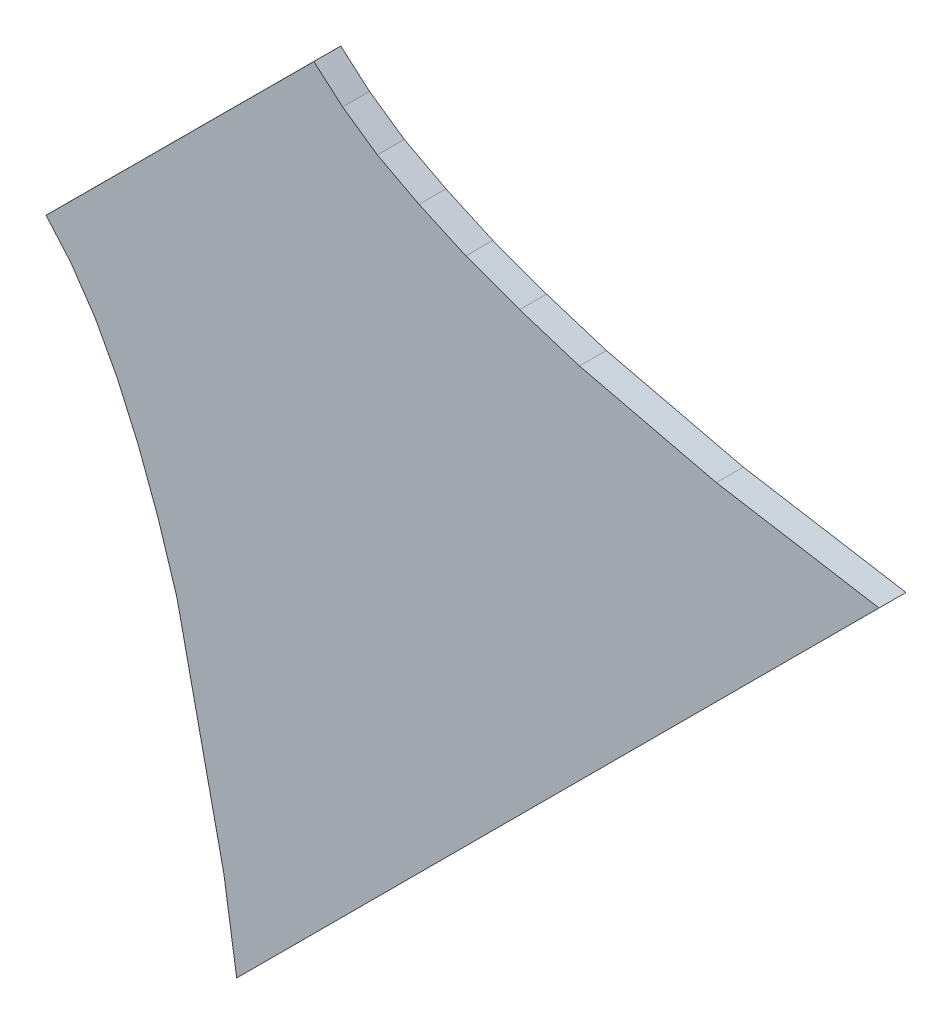
ISO-10303-21;
HEADER;
FILE_DESCRIPTION(('STEP AP214'),'2;1');
FILE_NAME('part.step','',(''),(''),'','','');
FILE_SCHEMA(('AUTOMOTIVE_DESIGN { 1 0 10303 214 1 1 1 1 }'));
ENDSEC;
DATA;
#1=APPLICATION_CONTEXT('core data for automotive mechanical design processes');
#2=APPLICATION_PROTOCOL_DEFINITION('international standard','automotive_design',2000,#1);
#3=PRODUCT_CONTEXT('',#1,'mechanical');
#4=PRODUCT('Part','Part','',(#3));
#5=PRODUCT_RELATED_PRODUCT_CATEGORY('part','',(#4));
#6=PRODUCT_DEFINITION_FORMATION('','',#4);
#7=PRODUCT_DEFINITION_CONTEXT('part definition',#1,'design');
#8=PRODUCT_DEFINITION('design','',#6,#7);
#9=PRODUCT_DEFINITION_SHAPE('','',#8);
#10=(LENGTH_UNIT() NAMED_UNIT(*) SI_UNIT(.MILLI.,.METRE.));
#11=(NAMED_UNIT(*) PLANE_ANGLE_UNIT() SI_UNIT($,.RADIAN.));
#12=(NAMED_UNIT(*) SI_UNIT($,.STERADIAN.) SOLID_ANGLE_UNIT());
#13=UNCERTAINTY_MEASURE_WITH_UNIT(LENGTH_MEASURE(1.E-05),#10,'distance_accuracy_value','');
#14=(GEOMETRIC_REPRESENTATION_CONTEXT(3) GLOBAL_UNCERTAINTY_ASSIGNED_CONTEXT((#13)) GLOBAL_UNIT_ASSIGNED_CONTEXT((#10,
#11,#12)) REPRESENTATION_CONTEXT('',''));
#15=CARTESIAN_POINT('',(0.,0.,0.));
#16=DIRECTION('',(0.,0.,1.));
#17=DIRECTION('',(1.,0.,0.));
#18=AXIS2_PLACEMENT_3D('',#15,#16,#17);
#19=CARTESIAN_POINT('',(47.1160011291504,102.430000305176,0.));
#20=DIRECTION('',(0.755078540245818,0.655634347834404,0.));
#21=DIRECTION('',(0.655634347834404,-0.755078540245818,0.));
#22=AXIS2_PLACEMENT_3D('',#19,#20,#21);
#23=PLANE('',#22);
#24=DIRECTION('',(0.655634347834404,-0.755078540245818,0.));
#25=VECTOR('',#24,1.);
#26=CARTESIAN_POINT('',(47.1160011291504,102.430000305176,0.03556));
#27=LINE('',#26,#25);
#28=CARTESIAN_POINT('',(47.1160011291504,102.430000305176,0.03556));
#29=VERTEX_POINT('',#28);
#30=CARTESIAN_POINT('',(47.148998260498,102.391998291016,0.03556));
#31=VERTEX_POINT('',#30);
#32=EDGE_CURVE('E11',#29,#31,#27,.T.);
#33=ORIENTED_EDGE('',*,*,#32,.F.);
#34=DIRECTION('',(0.,0.,1.));
#35=VECTOR('',#34,1.);
#36=CARTESIAN_POINT('',(47.1160011291504,102.430000305176,0.));
#37=LINE('',#36,#35);
#38=CARTESIAN_POINT('',(47.1160011291504,102.430000305176,0.));
#39=VERTEX_POINT('',#38);
#40=EDGE_CURVE('E24',#39,#29,#37,.T.);
#41=ORIENTED_EDGE('',*,*,#40,.F.);
#42=DIRECTION('',(0.655634347834404,-0.755078540245818,0.));
#43=VECTOR('',#42,1.);
#44=CARTESIAN_POINT('',(47.1160011291504,102.430000305176,0.));
#45=LINE('',#44,#43);
#46=CARTESIAN_POINT('',(47.148998260498,102.391998291016,0.));
#47=VERTEX_POINT('',#46);
#48=EDGE_CURVE('E160',#39,#47,#45,.T.);
#49=ORIENTED_EDGE('',*,*,#48,.T.);
#50=DIRECTION('',(0.,0.,1.));
#51=VECTOR('',#50,1.);
#52=CARTESIAN_POINT('',(47.148998260498,102.391998291016,0.));
#53=LINE('',#52,#51);
#54=EDGE_CURVE('E37',#47,#31,#53,.T.);
#55=ORIENTED_EDGE('',*,*,#54,.T.);
#56=EDGE_LOOP('',(#33,#41,#49,#55));
#57=FACE_BOUND('',#56,.T.);
#58=ADVANCED_FACE('F17',(#57),#23,.F.);
#59=CARTESIAN_POINT('',(47.1489982604981,102.391998291016,0.));
#60=DIRECTION('',(0.826570691534507,0.562832916500241,0.));
#61=DIRECTION('',(0.562832916500241,-0.826570691534507,0.));
#62=AXIS2_PLACEMENT_3D('',#59,#60,#61);
#63=PLANE('',#62);
#64=DIRECTION('',(0.562832916500241,-0.826570691534507,0.));
#65=VECTOR('',#64,1.);
#66=CARTESIAN_POINT('',(47.148998260498,102.391998291016,0.03556));
#67=LINE('',#66,#65);
#68=CARTESIAN_POINT('',(47.1809997558594,102.345001220703,0.03556));
#69=VERTEX_POINT('',#68);
#70=EDGE_CURVE('E280',#31,#69,#67,.T.);
#71=ORIENTED_EDGE('',*,*,#70,.F.);
#72=ORIENTED_EDGE('',*,*,#54,.F.);
#73=DIRECTION('',(0.562832916500241,-0.826570691534507,0.));
#74=VECTOR('',#73,1.);
#75=CARTESIAN_POINT('',(47.148998260498,102.391998291016,0.));
#76=LINE('',#75,#74);
#77=CARTESIAN_POINT('',(47.1809997558594,102.345001220703,0.));
#78=VERTEX_POINT('',#77);
#79=EDGE_CURVE('E277',#47,#78,#76,.T.);
#80=ORIENTED_EDGE('',*,*,#79,.T.);
#81=DIRECTION('',(0.,0.,1.));
#82=VECTOR('',#81,1.);
#83=CARTESIAN_POINT('',(47.1809997558594,102.345001220703,0.));
#84=LINE('',#83,#82);
#85=EDGE_CURVE('E275',#78,#69,#84,.T.);
#86=ORIENTED_EDGE('',*,*,#85,.T.);
#87=EDGE_LOOP('',(#71,#72,#80,#86));
#88=FACE_BOUND('',#87,.T.);
#89=ADVANCED_FACE('F288',(#88),#63,.F.);
#90=CARTESIAN_POINT('',(47.1809997558594,102.345001220703,0.));
#91=DIRECTION('',(0.881002115409217,0.473112325610403,0.));
#92=DIRECTION('',(0.473112325610403,-0.881002115409217,0.));
#93=AXIS2_PLACEMENT_3D('',#90,#91,#92);
#94=PLANE('',#93);
#95=DIRECTION('',(0.473112325610403,-0.881002115409217,0.));
#96=VECTOR('',#95,1.);
#97=CARTESIAN_POINT('',(47.1809997558594,102.345001220703,0.03556));
#98=LINE('',#97,#96);
#99=CARTESIAN_POINT('',(47.2099990844727,102.291000366211,0.03556));
#100=VERTEX_POINT('',#99);
#101=EDGE_CURVE('E272',#69,#100,#98,.T.);
#102=ORIENTED_EDGE('',*,*,#101,.F.);
#103=ORIENTED_EDGE('',*,*,#85,.F.);
#104=DIRECTION('',(0.473112325610403,-0.881002115409217,0.));
#105=VECTOR('',#104,1.);
#106=CARTESIAN_POINT('',(47.1809997558594,102.345001220703,0.));
#107=LINE('',#106,#105);
#108=CARTESIAN_POINT('',(47.2099990844727,102.291000366211,0.));
#109=VERTEX_POINT('',#108);
#110=EDGE_CURVE('E269',#78,#109,#107,.T.);
#111=ORIENTED_EDGE('',*,*,#110,.T.);
#112=DIRECTION('',(0.,0.,1.));
#113=VECTOR('',#112,1.);
#114=CARTESIAN_POINT('',(47.2099990844727,102.291000366211,0.));
#115=LINE('',#114,#113);
#116=EDGE_CURVE('E267',#109,#100,#115,.T.);
#117=ORIENTED_EDGE('',*,*,#116,.T.);
#118=EDGE_LOOP('',(#102,#103,#111,#117));
#119=FACE_BOUND('',#118,.T.);
#120=ADVANCED_FACE('F294',(#119),#94,.F.);
#121=CARTESIAN_POINT('',(47.2099990844727,102.291000366211,0.));
#122=DIRECTION('',(0.913820674891546,0.406117931321382,0.));
#123=DIRECTION('',(0.406117931321382,-0.913820674891546,0.));
#124=AXIS2_PLACEMENT_3D('',#121,#122,#123);
#125=PLANE('',#124);
#126=DIRECTION('',(0.406117931321382,-0.913820674891546,0.));
#127=VECTOR('',#126,1.);
#128=CARTESIAN_POINT('',(47.2099990844727,102.291000366211,0.03556));
#129=LINE('',#128,#127);
#130=CARTESIAN_POINT('',(47.2379989624023,102.227996826172,0.03556));
#131=VERTEX_POINT('',#130);
#132=EDGE_CURVE('E264',#100,#131,#129,.T.);
#133=ORIENTED_EDGE('',*,*,#132,.F.);
#134=ORIENTED_EDGE('',*,*,#116,.F.);
#135=DIRECTION('',(0.406117931321382,-0.913820674891546,0.));
#136=VECTOR('',#135,1.);
#137=CARTESIAN_POINT('',(47.2099990844727,102.291000366211,0.));
#138=LINE('',#137,#136);
#139=CARTESIAN_POINT('',(47.2379989624023,102.227996826172,0.));
#140=VERTEX_POINT('',#139);
#141=EDGE_CURVE('E261',#109,#140,#138,.T.);
#142=ORIENTED_EDGE('',*,*,#141,.T.);
#143=DIRECTION('',(0.,0.,1.));
#144=VECTOR('',#143,1.);
#145=CARTESIAN_POINT('',(47.2379989624023,102.227996826172,0.));
#146=LINE('',#145,#144);
#147=EDGE_CURVE('E259',#140,#131,#146,.T.);
#148=ORIENTED_EDGE('',*,*,#147,.T.);
#149=EDGE_LOOP('',(#133,#134,#142,#148));
#150=FACE_BOUND('',#149,.T.);
#151=ADVANCED_FACE('F296',(#150),#125,.F.);
#152=CARTESIAN_POINT('',(47.2379989624023,102.227996826172,0.));
#153=DIRECTION('',(0.937420507842954,0.348199355937742,0.));
#154=DIRECTION('',(0.348199355937742,-0.937420507842954,0.));
#155=AXIS2_PLACEMENT_3D('',#152,#153,#154);
#156=PLANE('',#155);
#157=DIRECTION('',(0.348199355937742,-0.937420507842954,0.));
#158=VECTOR('',#157,1.);
#159=CARTESIAN_POINT('',(47.2379989624023,102.227996826172,0.03556));
#160=LINE('',#159,#158);
#161=CARTESIAN_POINT('',(47.2639999389648,102.157997131348,0.03556));
#162=VERTEX_POINT('',#161);
#163=EDGE_CURVE('E256',#131,#162,#160,.T.);
#164=ORIENTED_EDGE('',*,*,#163,.F.);
#165=ORIENTED_EDGE('',*,*,#147,.F.);
#166=DIRECTION('',(0.348199355937742,-0.937420507842954,0.));
#167=VECTOR('',#166,1.);
#168=CARTESIAN_POINT('',(47.2379989624023,102.227996826172,0.));
#169=LINE('',#168,#167);
#170=CARTESIAN_POINT('',(47.2639999389648,102.157997131348,0.));
#171=VERTEX_POINT('',#170);
#172=EDGE_CURVE('E253',#140,#171,#169,.T.);
#173=ORIENTED_EDGE('',*,*,#172,.T.);
#174=DIRECTION('',(0.,0.,1.));
#175=VECTOR('',#174,1.);
#176=CARTESIAN_POINT('',(47.2639999389648,102.157997131348,0.));
#177=LINE('',#176,#175);
#178=EDGE_CURVE('E251',#171,#162,#177,.T.);
#179=ORIENTED_EDGE('',*,*,#178,.T.);
#180=EDGE_LOOP('',(#164,#165,#173,#179));
#181=FACE_BOUND('',#180,.T.);
#182=ADVANCED_FACE('F301',(#181),#156,.F.);
#183=CARTESIAN_POINT('',(47.2639999389648,102.157997131348,0.));
#184=DIRECTION('',(0.953389032291445,0.3017438534691,0.));
#185=DIRECTION('',(0.3017438534691,-0.953389032291445,0.));
#186=AXIS2_PLACEMENT_3D('',#183,#184,#185);
#187=PLANE('',#186);
#188=DIRECTION('',(0.3017438534691,-0.953389032291445,0.));
#189=VECTOR('',#188,1.);
#190=CARTESIAN_POINT('',(47.2639999389648,102.157997131348,0.03556));
#191=LINE('',#190,#189);
#192=CARTESIAN_POINT('',(47.2890014648438,102.079002380371,0.03556));
#193=VERTEX_POINT('',#192);
#194=EDGE_CURVE('E248',#162,#193,#191,.T.);
#195=ORIENTED_EDGE('',*,*,#194,.F.);
#196=ORIENTED_EDGE('',*,*,#178,.F.);
#197=DIRECTION('',(0.3017438534691,-0.953389032291445,0.));
#198=VECTOR('',#197,1.);
#199=CARTESIAN_POINT('',(47.2639999389648,102.157997131348,0.));
#200=LINE('',#199,#198);
#201=CARTESIAN_POINT('',(47.2890014648438,102.079002380371,0.));
#202=VERTEX_POINT('',#201);
#203=EDGE_CURVE('E245',#171,#202,#200,.T.);
#204=ORIENTED_EDGE('',*,*,#203,.T.);
#205=DIRECTION('',(0.,0.,1.));
#206=VECTOR('',#205,1.);
#207=CARTESIAN_POINT('',(47.2890014648438,102.079002380371,0.));
#208=LINE('',#207,#206);
#209=EDGE_CURVE('E243',#202,#193,#208,.T.);
#210=ORIENTED_EDGE('',*,*,#209,.T.);
#211=EDGE_LOOP('',(#195,#196,#204,#210));
#212=FACE_BOUND('',#211,.T.);
#213=ADVANCED_FACE('F304',(#212),#187,.F.);
#214=CARTESIAN_POINT('',(47.2890014648438,102.079002380371,0.));
#215=DIRECTION('',(0.977145781440368,0.212570274999335,0.));
#216=DIRECTION('',(0.212570274999335,-0.977145781440368,0.));
#217=AXIS2_PLACEMENT_3D('',#214,#215,#216);
#218=PLANE('',#217);
#219=DIRECTION('',(0.212570274999335,-0.977145781440368,0.));
#220=VECTOR('',#219,1.);
#221=CARTESIAN_POINT('',(47.2890014648438,102.079002380371,0.03556));
#222=LINE('',#221,#220);
#223=CARTESIAN_POINT('',(47.351001739502,101.793998718262,0.03556));
#224=VERTEX_POINT('',#223);
#225=EDGE_CURVE('E240',#193,#224,#222,.T.);
#226=ORIENTED_EDGE('',*,*,#225,.F.);
#227=ORIENTED_EDGE('',*,*,#209,.F.);
#228=DIRECTION('',(0.212570274999335,-0.977145781440368,0.));
#229=VECTOR('',#228,1.);
#230=CARTESIAN_POINT('',(47.2890014648438,102.079002380371,0.));
#231=LINE('',#230,#229);
#232=CARTESIAN_POINT('',(47.351001739502,101.793998718262,0.));
#233=VERTEX_POINT('',#232);
#234=EDGE_CURVE('E237',#202,#233,#231,.T.);
#235=ORIENTED_EDGE('',*,*,#234,.T.);
#236=DIRECTION('',(0.,0.,1.));
#237=VECTOR('',#236,1.);
#238=CARTESIAN_POINT('',(47.351001739502,101.793998718262,0.));
#239=LINE('',#238,#237);
#240=EDGE_CURVE('E235',#233,#224,#239,.T.);
#241=ORIENTED_EDGE('',*,*,#240,.T.);
#242=EDGE_LOOP('',(#226,#227,#235,#241));
#243=FACE_BOUND('',#242,.T.);
#244=ADVANCED_FACE('F309',(#243),#218,.F.);
#245=CARTESIAN_POINT('',(47.351001739502,101.793998718262,0.));
#246=DIRECTION('',(0.988476710855907,0.151373023010995,0.));
#247=DIRECTION('',(0.151373023010995,-0.988476710855907,0.));
#248=AXIS2_PLACEMENT_3D('',#245,#246,#247);
#249=PLANE('',#248);
#250=DIRECTION('',(0.151373023010995,-0.988476710855907,0.));
#251=VECTOR('',#250,1.);
#252=CARTESIAN_POINT('',(47.351001739502,101.793998718262,0.03556));
#253=LINE('',#252,#251);
#254=CARTESIAN_POINT('',(47.3680000305176,101.682998657227,0.03556));
#255=VERTEX_POINT('',#254);
#256=EDGE_CURVE('E232',#224,#255,#253,.T.);
#257=ORIENTED_EDGE('',*,*,#256,.F.);
#258=ORIENTED_EDGE('',*,*,#240,.F.);
#259=DIRECTION('',(0.151373023010995,-0.988476710855907,0.));
#260=VECTOR('',#259,1.);
#261=CARTESIAN_POINT('',(47.351001739502,101.793998718262,0.));
#262=LINE('',#261,#260);
#263=CARTESIAN_POINT('',(47.3680000305176,101.682998657227,0.));
#264=VERTEX_POINT('',#263);
#265=EDGE_CURVE('E229',#233,#264,#262,.T.);
#266=ORIENTED_EDGE('',*,*,#265,.T.);
#267=DIRECTION('',(0.,0.,1.));
#268=VECTOR('',#267,1.);
#269=CARTESIAN_POINT('',(47.3680000305176,101.682998657227,0.));
#270=LINE('',#269,#268);
#271=EDGE_CURVE('E227',#264,#255,#270,.T.);
#272=ORIENTED_EDGE('',*,*,#271,.T.);
#273=EDGE_LOOP('',(#257,#258,#266,#272));
#274=FACE_BOUND('',#273,.T.);
#275=ADVANCED_FACE('F312',(#274),#249,.F.);
#276=CARTESIAN_POINT('',(47.3680000305176,101.682998657227,0.));
#277=DIRECTION('',(-0.706690206684728,0.707523110418236,0.));
#278=DIRECTION('',(0.707523110418236,0.706690206684728,0.));
#279=AXIS2_PLACEMENT_3D('',#276,#277,#278);
#280=PLANE('',#279);
#281=DIRECTION('',(0.707523110418236,0.706690206684728,0.));
#282=VECTOR('',#281,1.);
#283=CARTESIAN_POINT('',(47.3680000305176,101.682998657227,0.03556));
#284=LINE('',#283,#282);
#285=CARTESIAN_POINT('',(48.2169990539551,102.530998229981,0.03556));
#286=VERTEX_POINT('',#285);
#287=EDGE_CURVE('E224',#255,#286,#284,.T.);
#288=ORIENTED_EDGE('',*,*,#287,.F.);
#289=ORIENTED_EDGE('',*,*,#271,.F.);
#290=DIRECTION('',(0.707523110418236,0.706690206684728,0.));
#291=VECTOR('',#290,1.);
#292=CARTESIAN_POINT('',(47.3680000305176,101.682998657227,0.));
#293=LINE('',#292,#291);
#294=CARTESIAN_POINT('',(48.2169990539551,102.530998229981,0.));
#295=VERTEX_POINT('',#294);
#296=EDGE_CURVE('E221',#264,#295,#293,.T.);
#297=ORIENTED_EDGE('',*,*,#296,.T.);
#298=DIRECTION('',(0.,0.,1.));
#299=VECTOR('',#298,1.);
#300=CARTESIAN_POINT('',(48.2169990539551,102.530998229981,0.));
#301=LINE('',#300,#299);
#302=EDGE_CURVE('E219',#295,#286,#301,.T.);
#303=ORIENTED_EDGE('',*,*,#302,.T.);
#304=EDGE_LOOP('',(#288,#289,#297,#303));
#305=FACE_BOUND('',#304,.T.);
#306=ADVANCED_FACE('F317',(#305),#280,.F.);
#307=CARTESIAN_POINT('',(48.2169990539551,102.530998229981,0.));
#308=DIRECTION('',(-0.165156602988561,-0.986267355481909,0.));
#309=DIRECTION('',(-0.986267355481909,0.165156602988561,0.));
#310=AXIS2_PLACEMENT_3D('',#307,#308,#309);
#311=PLANE('',#310);
#312=DIRECTION('',(-0.986267355481909,0.16515660298856,0.));
#313=VECTOR('',#312,1.);
#314=CARTESIAN_POINT('',(48.2169990539551,102.530998229981,0.03556));
#315=LINE('',#314,#313);
#316=CARTESIAN_POINT('',(48.0019989013672,102.567001342773,0.03556));
#317=VERTEX_POINT('',#316);
#318=EDGE_CURVE('E216',#286,#317,#315,.T.);
#319=ORIENTED_EDGE('',*,*,#318,.F.);
#320=ORIENTED_EDGE('',*,*,#302,.F.);
#321=DIRECTION('',(-0.986267355481909,0.16515660298856,0.));
#322=VECTOR('',#321,1.);
#323=CARTESIAN_POINT('',(48.2169990539551,102.530998229981,0.));
#324=LINE('',#323,#322);
#325=CARTESIAN_POINT('',(48.0019989013672,102.567001342773,0.));
#326=VERTEX_POINT('',#325);
#327=EDGE_CURVE('E213',#295,#326,#324,.T.);
#328=ORIENTED_EDGE('',*,*,#327,.T.);
#329=DIRECTION('',(0.,0.,1.));
#330=VECTOR('',#329,1.);
#331=CARTESIAN_POINT('',(48.0019989013672,102.567001342773,0.));
#332=LINE('',#331,#330);
#333=EDGE_CURVE('E211',#326,#317,#332,.T.);
#334=ORIENTED_EDGE('',*,*,#333,.T.);
#335=EDGE_LOOP('',(#319,#320,#328,#334));
#336=FACE_BOUND('',#335,.T.);
#337=ADVANCED_FACE('F320',(#336),#311,.F.);
#338=CARTESIAN_POINT('',(48.0019989013672,102.567001342773,0.));
#339=DIRECTION('',(-0.231132601870882,-0.972922258123637,0.));
#340=DIRECTION('',(-0.972922258123637,0.231132601870882,0.));
#341=AXIS2_PLACEMENT_3D('',#338,#339,#340);
#342=PLANE('',#341);
#343=DIRECTION('',(-0.972922258123637,0.231132601870882,0.));
#344=VECTOR('',#343,1.);
#345=CARTESIAN_POINT('',(48.0019989013672,102.567001342773,0.03556));
#346=LINE('',#345,#344);
#347=CARTESIAN_POINT('',(47.8209991455078,102.610000610352,0.03556));
#348=VERTEX_POINT('',#347);
#349=EDGE_CURVE('E208',#317,#348,#346,.T.);
#350=ORIENTED_EDGE('',*,*,#349,.F.);
#351=ORIENTED_EDGE('',*,*,#333,.F.);
#352=DIRECTION('',(-0.972922258123637,0.231132601870882,0.));
#353=VECTOR('',#352,1.);
#354=CARTESIAN_POINT('',(48.0019989013672,102.567001342773,0.));
#355=LINE('',#354,#353);
#356=CARTESIAN_POINT('',(47.8209991455078,102.610000610352,0.));
#357=VERTEX_POINT('',#356);
#358=EDGE_CURVE('E205',#326,#357,#355,.T.);
#359=ORIENTED_EDGE('',*,*,#358,.T.);
#360=DIRECTION('',(0.,0.,1.));
#361=VECTOR('',#360,1.);
#362=CARTESIAN_POINT('',(47.8209991455078,102.610000610352,0.));
#363=LINE('',#362,#361);
#364=EDGE_CURVE('E203',#357,#348,#363,.T.);
#365=ORIENTED_EDGE('',*,*,#364,.T.);
#366=EDGE_LOOP('',(#350,#351,#359,#365));
#367=FACE_BOUND('',#366,.T.);
#368=ADVANCED_FACE('F325',(#367),#342,.F.);
#369=CARTESIAN_POINT('',(47.8209991455078,102.610000610352,0.));
#370=DIRECTION('',(-0.301730609368488,-0.953393223895639,0.));
#371=DIRECTION('',(-0.953393223895639,0.301730609368488,0.));
#372=AXIS2_PLACEMENT_3D('',#369,#370,#371);
#373=PLANE('',#372);
#374=DIRECTION('',(-0.953393223895639,0.301730609368488,0.));
#375=VECTOR('',#374,1.);
#376=CARTESIAN_POINT('',(47.8209991455078,102.610000610352,0.03556));
#377=LINE('',#376,#375);
#378=CARTESIAN_POINT('',(47.742000579834,102.63500213623,0.03556));
#379=VERTEX_POINT('',#378);
#380=EDGE_CURVE('E200',#348,#379,#377,.T.);
#381=ORIENTED_EDGE('',*,*,#380,.F.);
#382=ORIENTED_EDGE('',*,*,#364,.F.);
#383=DIRECTION('',(-0.953393223895639,0.301730609368488,0.));
#384=VECTOR('',#383,1.);
#385=CARTESIAN_POINT('',(47.8209991455078,102.610000610352,0.));
#386=LINE('',#385,#384);
#387=CARTESIAN_POINT('',(47.742000579834,102.63500213623,0.));
#388=VERTEX_POINT('',#387);
#389=EDGE_CURVE('E197',#357,#388,#386,.T.);
#390=ORIENTED_EDGE('',*,*,#389,.T.);
#391=DIRECTION('',(0.,0.,1.));
#392=VECTOR('',#391,1.);
#393=CARTESIAN_POINT('',(47.742000579834,102.63500213623,0.));
#394=LINE('',#393,#392);
#395=EDGE_CURVE('E195',#388,#379,#394,.T.);
#396=ORIENTED_EDGE('',*,*,#395,.T.);
#397=EDGE_LOOP('',(#381,#382,#390,#396));
#398=FACE_BOUND('',#397,.T.);
#399=ADVANCED_FACE('F328',(#398),#373,.F.);
#400=CARTESIAN_POINT('',(47.742000579834,102.63500213623,0.));
#401=DIRECTION('',(-0.343881049565291,-0.939013218091138,0.));
#402=DIRECTION('',(-0.939013218091138,0.343881049565291,0.));
#403=AXIS2_PLACEMENT_3D('',#400,#401,#402);
#404=PLANE('',#403);
#405=DIRECTION('',(-0.939013218091137,0.343881049565291,0.));
#406=VECTOR('',#405,1.);
#407=CARTESIAN_POINT('',(47.742000579834,102.63500213623,0.03556));
#408=LINE('',#407,#406);
#409=CARTESIAN_POINT('',(47.6710014343262,102.661003112793,0.03556));
#410=VERTEX_POINT('',#409);
#411=EDGE_CURVE('E192',#379,#410,#408,.T.);
#412=ORIENTED_EDGE('',*,*,#411,.F.);
#413=ORIENTED_EDGE('',*,*,#395,.F.);
#414=DIRECTION('',(-0.939013218091137,0.343881049565291,0.));
#415=VECTOR('',#414,1.);
#416=CARTESIAN_POINT('',(47.742000579834,102.63500213623,0.));
#417=LINE('',#416,#415);
#418=CARTESIAN_POINT('',(47.6710014343262,102.661003112793,0.));
#419=VERTEX_POINT('',#418);
#420=EDGE_CURVE('E189',#388,#419,#417,.T.);
#421=ORIENTED_EDGE('',*,*,#420,.T.);
#422=DIRECTION('',(0.,0.,1.));
#423=VECTOR('',#422,1.);
#424=CARTESIAN_POINT('',(47.6710014343262,102.661003112793,0.));
#425=LINE('',#424,#423);
#426=EDGE_CURVE('E187',#419,#410,#425,.T.);
#427=ORIENTED_EDGE('',*,*,#426,.T.);
#428=EDGE_LOOP('',(#412,#413,#421,#427));
#429=FACE_BOUND('',#428,.T.);
#430=ADVANCED_FACE('F333',(#429),#404,.F.);
#431=CARTESIAN_POINT('',(47.6710014343262,102.661003112793,0.));
#432=DIRECTION('',(-0.411583717590458,-0.911371956675439,0.));
#433=DIRECTION('',(-0.911371956675439,0.411583717590458,0.));
#434=AXIS2_PLACEMENT_3D('',#431,#432,#433);
#435=PLANE('',#434);
#436=DIRECTION('',(-0.911371956675439,0.411583717590458,0.));
#437=VECTOR('',#436,1.);
#438=CARTESIAN_POINT('',(47.6710014343262,102.661003112793,0.03556));
#439=LINE('',#438,#437);
#440=CARTESIAN_POINT('',(47.609001159668,102.689002990723,0.03556));
#441=VERTEX_POINT('',#440);
#442=EDGE_CURVE('E184',#410,#441,#439,.T.);
#443=ORIENTED_EDGE('',*,*,#442,.F.);
#444=ORIENTED_EDGE('',*,*,#426,.F.);
#445=DIRECTION('',(-0.911371956675439,0.411583717590458,0.));
#446=VECTOR('',#445,1.);
#447=CARTESIAN_POINT('',(47.6710014343262,102.661003112793,0.));
#448=LINE('',#447,#446);
#449=CARTESIAN_POINT('',(47.609001159668,102.689002990723,0.));
#450=VERTEX_POINT('',#449);
#451=EDGE_CURVE('E181',#419,#450,#448,.T.);
#452=ORIENTED_EDGE('',*,*,#451,.T.);
#453=DIRECTION('',(0.,0.,1.));
#454=VECTOR('',#453,1.);
#455=CARTESIAN_POINT('',(47.609001159668,102.689002990723,0.));
#456=LINE('',#455,#454);
#457=EDGE_CURVE('E179',#450,#441,#456,.T.);
#458=ORIENTED_EDGE('',*,*,#457,.T.);
#459=EDGE_LOOP('',(#443,#444,#452,#458));
#460=FACE_BOUND('',#459,.T.);
#461=ADVANCED_FACE('F336',(#460),#435,.F.);
#462=CARTESIAN_POINT('',(47.609001159668,102.689002990723,0.));
#463=DIRECTION('',(-0.466398688066183,-0.884574623064749,0.));
#464=DIRECTION('',(-0.884574623064749,0.466398688066183,0.));
#465=AXIS2_PLACEMENT_3D('',#462,#463,#464);
#466=PLANE('',#465);
#467=DIRECTION('',(-0.884574623064749,0.466398688066183,0.));
#468=VECTOR('',#467,1.);
#469=CARTESIAN_POINT('',(47.609001159668,102.689002990723,0.03556));
#470=LINE('',#469,#468);
#471=CARTESIAN_POINT('',(47.5540008544922,102.718002319336,0.03556));
#472=VERTEX_POINT('',#471);
#473=EDGE_CURVE('E176',#441,#472,#470,.T.);
#474=ORIENTED_EDGE('',*,*,#473,.F.);
#475=ORIENTED_EDGE('',*,*,#457,.F.);
#476=DIRECTION('',(-0.884574623064749,0.466398688066183,0.));
#477=VECTOR('',#476,1.);
#478=CARTESIAN_POINT('',(47.609001159668,102.689002990723,0.));
#479=LINE('',#478,#477);
#480=CARTESIAN_POINT('',(47.5540008544922,102.718002319336,0.));
#481=VERTEX_POINT('',#480);
#482=EDGE_CURVE('E173',#450,#481,#479,.T.);
#483=ORIENTED_EDGE('',*,*,#482,.T.);
#484=DIRECTION('',(0.,0.,1.));
#485=VECTOR('',#484,1.);
#486=CARTESIAN_POINT('',(47.5540008544922,102.718002319336,0.));
#487=LINE('',#486,#485);
#488=EDGE_CURVE('E171',#481,#472,#487,.T.);
#489=ORIENTED_EDGE('',*,*,#488,.T.);
#490=EDGE_LOOP('',(#474,#475,#483,#489));
#491=FACE_BOUND('',#490,.T.);
#492=ADVANCED_FACE('F341',(#491),#466,.F.);
#493=CARTESIAN_POINT('',(47.5540008544922,102.718002319336,0.));
#494=DIRECTION('',(-0.571024595638433,-0.820932951693355,0.));
#495=DIRECTION('',(-0.820932951693355,0.571024595638433,0.));
#496=AXIS2_PLACEMENT_3D('',#493,#494,#495);
#497=PLANE('',#496);
#498=DIRECTION('',(-0.820932951693355,0.571024595638433,0.));
#499=VECTOR('',#498,1.);
#500=CARTESIAN_POINT('',(47.5540008544922,102.718002319336,0.03556));
#501=LINE('',#500,#499);
#502=CARTESIAN_POINT('',(47.507999420166,102.75,0.03556));
#503=VERTEX_POINT('',#502);
#504=EDGE_CURVE('E168',#472,#503,#501,.T.);
#505=ORIENTED_EDGE('',*,*,#504,.F.);
#506=ORIENTED_EDGE('',*,*,#488,.F.);
#507=DIRECTION('',(-0.820932951693355,0.571024595638433,0.));
#508=VECTOR('',#507,1.);
#509=CARTESIAN_POINT('',(47.5540008544922,102.718002319336,0.));
#510=LINE('',#509,#508);
#511=CARTESIAN_POINT('',(47.507999420166,102.75,0.));
#512=VERTEX_POINT('',#511);
#513=EDGE_CURVE('E166',#481,#512,#510,.T.);
#514=ORIENTED_EDGE('',*,*,#513,.T.);
#515=DIRECTION('',(0.,0.,1.));
#516=VECTOR('',#515,1.);
#517=CARTESIAN_POINT('',(47.507999420166,102.75,0.));
#518=LINE('',#517,#516);
#519=EDGE_CURVE('E151',#512,#503,#518,.T.);
#520=ORIENTED_EDGE('',*,*,#519,.T.);
#521=EDGE_LOOP('',(#505,#506,#514,#520));
#522=FACE_BOUND('',#521,.T.);
#523=ADVANCED_FACE('F343',(#522),#497,.F.);
#524=CARTESIAN_POINT('',(47.507999420166,102.75,0.));
#525=DIRECTION('',(-0.655671872333227,-0.755045956105349,0.));
#526=DIRECTION('',(-0.755045956105349,0.655671872333227,0.));
#527=AXIS2_PLACEMENT_3D('',#524,#525,#526);
#528=PLANE('',#527);
#529=DIRECTION('',(-0.755045956105349,0.655671872333227,0.));
#530=VECTOR('',#529,1.);
#531=CARTESIAN_POINT('',(47.507999420166,102.75,0.03556));
#532=LINE('',#531,#530);
#533=CARTESIAN_POINT('',(47.4700012207031,102.782997131348,0.03556));
#534=VERTEX_POINT('',#533);
#535=EDGE_CURVE('E155',#503,#534,#532,.T.);
#536=ORIENTED_EDGE('',*,*,#535,.F.);
#537=ORIENTED_EDGE('',*,*,#519,.F.);
#538=DIRECTION('',(-0.755045956105349,0.655671872333227,0.));
#539=VECTOR('',#538,1.);
#540=CARTESIAN_POINT('',(47.507999420166,102.75,0.));
#541=LINE('',#540,#539);
#542=CARTESIAN_POINT('',(47.4700012207031,102.782997131348,0.));
#543=VERTEX_POINT('',#542);
#544=EDGE_CURVE('E147',#512,#543,#541,.T.);
#545=ORIENTED_EDGE('',*,*,#544,.T.);
#546=DIRECTION('',(0.,0.,1.));
#547=VECTOR('',#546,1.);
#548=CARTESIAN_POINT('',(47.4700012207031,102.782997131348,0.));
#549=LINE('',#548,#547);
#550=EDGE_CURVE('E137',#543,#534,#549,.T.);
#551=ORIENTED_EDGE('',*,*,#550,.T.);
#552=EDGE_LOOP('',(#536,#537,#545,#551));
#553=FACE_BOUND('',#552,.T.);
#554=ADVANCED_FACE('F150',(#553),#528,.F.);
#555=CARTESIAN_POINT('',(47.4700012207031,102.782997131348,0.));
#556=DIRECTION('',(0.706102648961614,-0.708109489506666,0.));
#557=DIRECTION('',(-0.708109489506666,-0.706102648961614,0.));
#558=AXIS2_PLACEMENT_3D('',#555,#556,#557);
#559=PLANE('',#558);
#560=DIRECTION('',(-0.708109489506666,-0.706102648961614,0.));
#561=VECTOR('',#560,1.);
#562=CARTESIAN_POINT('',(47.4700012207031,102.782997131348,0.03556));
#563=LINE('',#562,#561);
#564=EDGE_CURVE('E143',#534,#29,#563,.T.);
#565=ORIENTED_EDGE('',*,*,#564,.F.);
#566=ORIENTED_EDGE('',*,*,#550,.F.);
#567=DIRECTION('',(-0.708109489506666,-0.706102648961614,0.));
#568=VECTOR('',#567,1.);
#569=CARTESIAN_POINT('',(47.4700012207031,102.782997131348,0.));
#570=LINE('',#569,#568);
#571=EDGE_CURVE('E141',#543,#39,#570,.T.);
#572=ORIENTED_EDGE('',*,*,#571,.T.);
#573=ORIENTED_EDGE('',*,*,#40,.T.);
#574=EDGE_LOOP('',(#565,#566,#572,#573));
#575=FACE_BOUND('',#574,.T.);
#576=ADVANCED_FACE('F139',(#575),#559,.F.);
#577=CARTESIAN_POINT('',(47.1160011291504,102.430000305176,0.));
#578=DIRECTION('',(0.,0.,1.));
#579=DIRECTION('',(1.,0.,0.));
#580=AXIS2_PLACEMENT_3D('',#577,#578,#579);
#581=PLANE('',#580);
#582=ORIENTED_EDGE('',*,*,#571,.F.);
#583=ORIENTED_EDGE('',*,*,#544,.F.);
#584=ORIENTED_EDGE('',*,*,#513,.F.);
#585=ORIENTED_EDGE('',*,*,#482,.F.);
#586=ORIENTED_EDGE('',*,*,#451,.F.);
#587=ORIENTED_EDGE('',*,*,#420,.F.);
#588=ORIENTED_EDGE('',*,*,#389,.F.);
#589=ORIENTED_EDGE('',*,*,#358,.F.);
#590=ORIENTED_EDGE('',*,*,#327,.F.);
#591=ORIENTED_EDGE('',*,*,#296,.F.);
#592=ORIENTED_EDGE('',*,*,#265,.F.);
#593=ORIENTED_EDGE('',*,*,#234,.F.);
#594=ORIENTED_EDGE('',*,*,#203,.F.);
#595=ORIENTED_EDGE('',*,*,#172,.F.);
#596=ORIENTED_EDGE('',*,*,#141,.F.);
#597=ORIENTED_EDGE('',*,*,#110,.F.);
#598=ORIENTED_EDGE('',*,*,#79,.F.);
#599=ORIENTED_EDGE('',*,*,#48,.F.);
#600=EDGE_LOOP('',(#582,#583,#584,#585,#586,#587,#588,#589,#590,#591,#592,#593,#594,#595,#596,
#597,#598,#599));
#601=FACE_BOUND('',#600,.T.);
#602=ADVANCED_FACE('F158',(#601),#581,.F.);
#603=CARTESIAN_POINT('',(47.1160011291504,102.430000305176,0.03556));
#604=DIRECTION('',(0.,0.,1.));
#605=DIRECTION('',(1.,0.,0.));
#606=AXIS2_PLACEMENT_3D('',#603,#604,#605);
#607=PLANE('',#606);
#608=ORIENTED_EDGE('',*,*,#32,.T.);
#609=ORIENTED_EDGE('',*,*,#70,.T.);
#610=ORIENTED_EDGE('',*,*,#101,.T.);
#611=ORIENTED_EDGE('',*,*,#132,.T.);
#612=ORIENTED_EDGE('',*,*,#163,.T.);
#613=ORIENTED_EDGE('',*,*,#194,.T.);
#614=ORIENTED_EDGE('',*,*,#225,.T.);
#615=ORIENTED_EDGE('',*,*,#256,.T.);
#616=ORIENTED_EDGE('',*,*,#287,.T.);
#617=ORIENTED_EDGE('',*,*,#318,.T.);
#618=ORIENTED_EDGE('',*,*,#349,.T.);
#619=ORIENTED_EDGE('',*,*,#380,.T.);
#620=ORIENTED_EDGE('',*,*,#411,.T.);
#621=ORIENTED_EDGE('',*,*,#442,.T.);
#622=ORIENTED_EDGE('',*,*,#473,.T.);
#623=ORIENTED_EDGE('',*,*,#504,.T.);
#624=ORIENTED_EDGE('',*,*,#535,.T.);
#625=ORIENTED_EDGE('',*,*,#564,.T.);
#626=EDGE_LOOP('',(#608,#609,#610,#611,#612,#613,#614,#615,#616,#617,#618,#619,#620,#621,#622,
#623,#624,#625));
#627=FACE_BOUND('',#626,.T.);
#628=ADVANCED_FACE('F291',(#627),#607,.T.);
#629=CLOSED_SHELL('',(#58,#89,#120,#151,#182,#213,#244,#275,#306,#337,#368,#399,#430,#461,#492,
#523,#554,#576,#602,#628));
#630=MANIFOLD_SOLID_BREP('B1',#629);
#631=ADVANCED_BREP_SHAPE_REPRESENTATION('',(#18,#630),#14);
#632=SHAPE_DEFINITION_REPRESENTATION(#9,#631);
ENDSEC;
END-ISO-10303-21;
